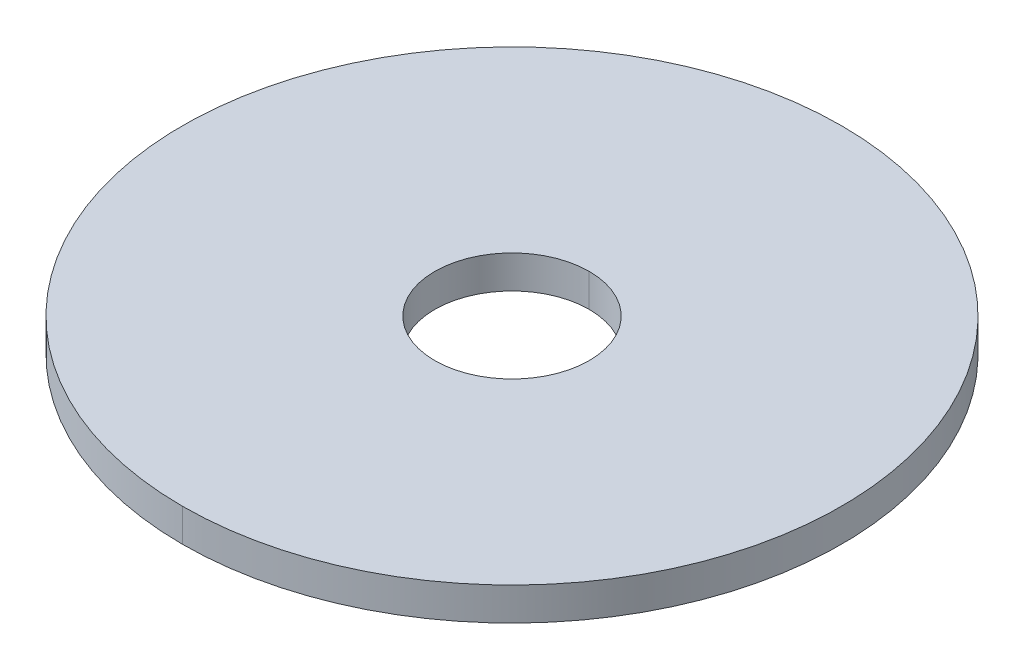
ISO-10303-21;
HEADER;
FILE_DESCRIPTION(('STEP AP214'),'2;1');
FILE_NAME('part.step','',(''),(''),'','','');
FILE_SCHEMA(('AUTOMOTIVE_DESIGN { 1 0 10303 214 1 1 1 1 }'));
ENDSEC;
DATA;
#1=APPLICATION_CONTEXT('core data for automotive mechanical design processes');
#2=APPLICATION_PROTOCOL_DEFINITION('international standard','automotive_design',2000,#1);
#3=PRODUCT_CONTEXT('',#1,'mechanical');
#4=PRODUCT('Part','Part','',(#3));
#5=PRODUCT_RELATED_PRODUCT_CATEGORY('part','',(#4));
#6=PRODUCT_DEFINITION_FORMATION('','',#4);
#7=PRODUCT_DEFINITION_CONTEXT('part definition',#1,'design');
#8=PRODUCT_DEFINITION('design','',#6,#7);
#9=PRODUCT_DEFINITION_SHAPE('','',#8);
#10=(LENGTH_UNIT() NAMED_UNIT(*) SI_UNIT(.MILLI.,.METRE.));
#11=(NAMED_UNIT(*) PLANE_ANGLE_UNIT() SI_UNIT($,.RADIAN.));
#12=(NAMED_UNIT(*) SI_UNIT($,.STERADIAN.) SOLID_ANGLE_UNIT());
#13=UNCERTAINTY_MEASURE_WITH_UNIT(LENGTH_MEASURE(1.E-05),#10,'distance_accuracy_value','');
#14=(GEOMETRIC_REPRESENTATION_CONTEXT(3) GLOBAL_UNCERTAINTY_ASSIGNED_CONTEXT((#13)) GLOBAL_UNIT_ASSIGNED_CONTEXT((#10,
#11,#12)) REPRESENTATION_CONTEXT('',''));
#15=CARTESIAN_POINT('',(0.,0.,0.));
#16=DIRECTION('',(0.,0.,1.));
#17=DIRECTION('',(1.,0.,0.));
#18=AXIS2_PLACEMENT_3D('',#15,#16,#17);
#19=CARTESIAN_POINT('',(0.,1.6,0.));
#20=DIRECTION('',(0.,-1.,0.));
#21=DIRECTION('',(0.,0.,-1.));
#22=AXIS2_PLACEMENT_3D('',#19,#20,#21);
#23=CYLINDRICAL_SURFACE('',#22,3.75);
#24=DIRECTION('',(0.,-1.,0.));
#25=VECTOR('',#24,1.);
#26=CARTESIAN_POINT('',(0.,0.8,-3.75));
#27=LINE('',#26,#25);
#28=CARTESIAN_POINT('',(0.,1.6,-3.75));
#29=VERTEX_POINT('',#28);
#30=CARTESIAN_POINT('',(0.,0.,-3.75));
#31=VERTEX_POINT('',#30);
#32=EDGE_CURVE('E67',#29,#31,#27,.T.);
#33=ORIENTED_EDGE('',*,*,#32,.F.);
#34=CARTESIAN_POINT('',(0.,1.6,0.));
#35=DIRECTION('',(0.,1.,0.));
#36=DIRECTION('',(0.,0.,-1.));
#37=AXIS2_PLACEMENT_3D('',#34,#35,#36);
#38=CIRCLE('',#37,3.75);
#39=CARTESIAN_POINT('',(0.,1.6,3.75));
#40=VERTEX_POINT('',#39);
#41=EDGE_CURVE('E11',#29,#40,#38,.T.);
#42=ORIENTED_EDGE('',*,*,#41,.T.);
#43=DIRECTION('',(0.,-1.,0.));
#44=VECTOR('',#43,1.);
#45=CARTESIAN_POINT('',(0.,0.8,3.75));
#46=LINE('',#45,#44);
#47=CARTESIAN_POINT('',(0.,0.,3.75));
#48=VERTEX_POINT('',#47);
#49=EDGE_CURVE('E64',#40,#48,#46,.T.);
#50=ORIENTED_EDGE('',*,*,#49,.T.);
#51=CARTESIAN_POINT('',(0.,0.,0.));
#52=DIRECTION('',(0.,1.,0.));
#53=DIRECTION('',(0.,0.,-1.));
#54=AXIS2_PLACEMENT_3D('',#51,#52,#53);
#55=CIRCLE('',#54,3.75);
#56=EDGE_CURVE('E106',#31,#48,#55,.T.);
#57=ORIENTED_EDGE('',*,*,#56,.F.);
#58=EDGE_LOOP('',(#33,#42,#50,#57));
#59=FACE_BOUND('',#58,.T.);
#60=ADVANCED_FACE('F16',(#59),#23,.F.);
#61=CARTESIAN_POINT('',(0.,0.,0.));
#62=DIRECTION('',(0.,1.,0.));
#63=DIRECTION('',(-1.,0.,0.));
#64=AXIS2_PLACEMENT_3D('',#61,#62,#63);
#65=CYLINDRICAL_SURFACE('',#64,16.);
#66=DIRECTION('',(0.,1.,0.));
#67=VECTOR('',#66,1.);
#68=CARTESIAN_POINT('',(0.,0.8,-16.));
#69=LINE('',#68,#67);
#70=CARTESIAN_POINT('',(0.,0.,-16.));
#71=VERTEX_POINT('',#70);
#72=CARTESIAN_POINT('',(0.,1.6,-16.));
#73=VERTEX_POINT('',#72);
#74=EDGE_CURVE('E92',#71,#73,#69,.T.);
#75=ORIENTED_EDGE('',*,*,#74,.F.);
#76=CARTESIAN_POINT('',(0.,0.,0.));
#77=DIRECTION('',(0.,1.,0.));
#78=DIRECTION('',(0.,0.,-1.));
#79=AXIS2_PLACEMENT_3D('',#76,#77,#78);
#80=CIRCLE('',#79,16.);
#81=CARTESIAN_POINT('',(0.,0.,16.));
#82=VERTEX_POINT('',#81);
#83=EDGE_CURVE('E102',#71,#82,#80,.T.);
#84=ORIENTED_EDGE('',*,*,#83,.T.);
#85=DIRECTION('',(0.,1.,0.));
#86=VECTOR('',#85,1.);
#87=CARTESIAN_POINT('',(0.,0.8,16.));
#88=LINE('',#87,#86);
#89=CARTESIAN_POINT('',(0.,1.6,16.));
#90=VERTEX_POINT('',#89);
#91=EDGE_CURVE('E99',#82,#90,#88,.T.);
#92=ORIENTED_EDGE('',*,*,#91,.T.);
#93=CARTESIAN_POINT('',(0.,1.6,0.));
#94=DIRECTION('',(0.,1.,0.));
#95=DIRECTION('',(0.,0.,-1.));
#96=AXIS2_PLACEMENT_3D('',#93,#94,#95);
#97=CIRCLE('',#96,16.);
#98=EDGE_CURVE('E27',#73,#90,#97,.T.);
#99=ORIENTED_EDGE('',*,*,#98,.F.);
#100=EDGE_LOOP('',(#75,#84,#92,#99));
#101=FACE_BOUND('',#100,.T.);
#102=ADVANCED_FACE('F126',(#101),#65,.T.);
#103=CARTESIAN_POINT('',(-16.01,1.6,-16.01));
#104=DIRECTION('',(0.,1.,0.));
#105=DIRECTION('',(0.,0.,1.));
#106=AXIS2_PLACEMENT_3D('',#103,#104,#105);
#107=PLANE('',#106);
#108=ORIENTED_EDGE('',*,*,#41,.F.);
#109=CARTESIAN_POINT('',(0.,1.6,0.));
#110=DIRECTION('',(0.,1.,0.));
#111=DIRECTION('',(0.,0.,1.));
#112=AXIS2_PLACEMENT_3D('',#109,#110,#111);
#113=CIRCLE('',#112,3.75);
#114=EDGE_CURVE('E20',#40,#29,#113,.T.);
#115=ORIENTED_EDGE('',*,*,#114,.F.);
#116=EDGE_LOOP('',(#108,#115));
#117=FACE_BOUND('',#116,.T.);
#118=ORIENTED_EDGE('',*,*,#98,.T.);
#119=CARTESIAN_POINT('',(0.,1.6,0.));
#120=DIRECTION('',(0.,1.,0.));
#121=DIRECTION('',(0.,0.,1.));
#122=AXIS2_PLACEMENT_3D('',#119,#120,#121);
#123=CIRCLE('',#122,16.);
#124=EDGE_CURVE('E96',#90,#73,#123,.T.);
#125=ORIENTED_EDGE('',*,*,#124,.T.);
#126=EDGE_LOOP('',(#118,#125));
#127=FACE_BOUND('',#126,.T.);
#128=ADVANCED_FACE('F77',(#117,#127),#107,.T.);
#129=CARTESIAN_POINT('',(-16.01,0.,16.01));
#130=DIRECTION('',(0.,-1.,0.));
#131=DIRECTION('',(0.,0.,-1.));
#132=AXIS2_PLACEMENT_3D('',#129,#130,#131);
#133=PLANE('',#132);
#134=ORIENTED_EDGE('',*,*,#56,.T.);
#135=CARTESIAN_POINT('',(0.,0.,0.));
#136=DIRECTION('',(0.,1.,0.));
#137=DIRECTION('',(0.,0.,1.));
#138=AXIS2_PLACEMENT_3D('',#135,#136,#137);
#139=CIRCLE('',#138,3.75);
#140=EDGE_CURVE('E73',#48,#31,#139,.T.);
#141=ORIENTED_EDGE('',*,*,#140,.T.);
#142=EDGE_LOOP('',(#134,#141));
#143=FACE_BOUND('',#142,.T.);
#144=ORIENTED_EDGE('',*,*,#83,.F.);
#145=CARTESIAN_POINT('',(0.,0.,0.));
#146=DIRECTION('',(0.,1.,0.));
#147=DIRECTION('',(0.,0.,1.));
#148=AXIS2_PLACEMENT_3D('',#145,#146,#147);
#149=CIRCLE('',#148,16.);
#150=EDGE_CURVE('E75',#82,#71,#149,.T.);
#151=ORIENTED_EDGE('',*,*,#150,.F.);
#152=EDGE_LOOP('',(#144,#151));
#153=FACE_BOUND('',#152,.T.);
#154=ADVANCED_FACE('F155',(#143,#153),#133,.T.);
#155=CARTESIAN_POINT('',(0.,0.,0.));
#156=DIRECTION('',(0.,1.,0.));
#157=DIRECTION('',(0.,0.,1.));
#158=AXIS2_PLACEMENT_3D('',#155,#156,#157);
#159=CYLINDRICAL_SURFACE('',#158,16.);
#160=ORIENTED_EDGE('',*,*,#150,.T.);
#161=ORIENTED_EDGE('',*,*,#74,.T.);
#162=ORIENTED_EDGE('',*,*,#124,.F.);
#163=ORIENTED_EDGE('',*,*,#91,.F.);
#164=EDGE_LOOP('',(#160,#161,#162,#163));
#165=FACE_BOUND('',#164,.T.);
#166=ADVANCED_FACE('F150',(#165),#159,.T.);
#167=CARTESIAN_POINT('',(0.,1.6,0.));
#168=DIRECTION('',(0.,-1.,0.));
#169=DIRECTION('',(1.,0.,0.));
#170=AXIS2_PLACEMENT_3D('',#167,#168,#169);
#171=CYLINDRICAL_SURFACE('',#170,3.75);
#172=ORIENTED_EDGE('',*,*,#114,.T.);
#173=ORIENTED_EDGE('',*,*,#32,.T.);
#174=ORIENTED_EDGE('',*,*,#140,.F.);
#175=ORIENTED_EDGE('',*,*,#49,.F.);
#176=EDGE_LOOP('',(#172,#173,#174,#175));
#177=FACE_BOUND('',#176,.T.);
#178=ADVANCED_FACE('F18',(#177),#171,.F.);
#179=CLOSED_SHELL('',(#60,#102,#128,#154,#166,#178));
#180=MANIFOLD_SOLID_BREP('B1',#179);
#181=ADVANCED_BREP_SHAPE_REPRESENTATION('',(#18,#180),#14);
#182=SHAPE_DEFINITION_REPRESENTATION(#9,#181);
ENDSEC;
END-ISO-10303-21;
